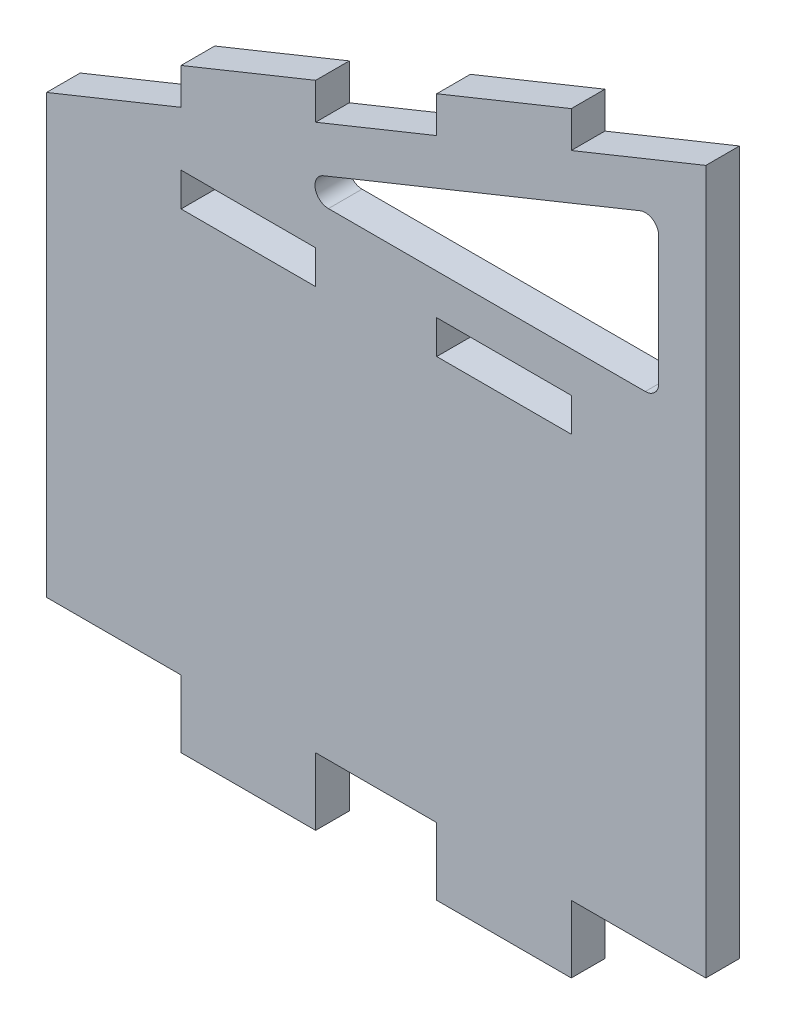
ISO-10303-21;
HEADER;
FILE_DESCRIPTION(('STEP AP214'),'2;1');
FILE_NAME('part.step','',(''),(''),'','','');
FILE_SCHEMA(('AUTOMOTIVE_DESIGN { 1 0 10303 214 1 1 1 1 }'));
ENDSEC;
DATA;
#1=APPLICATION_CONTEXT('core data for automotive mechanical design processes');
#2=APPLICATION_PROTOCOL_DEFINITION('international standard','automotive_design',2000,#1);
#3=PRODUCT_CONTEXT('',#1,'mechanical');
#4=PRODUCT('Part','Part','',(#3));
#5=PRODUCT_RELATED_PRODUCT_CATEGORY('part','',(#4));
#6=PRODUCT_DEFINITION_FORMATION('','',#4);
#7=PRODUCT_DEFINITION_CONTEXT('part definition',#1,'design');
#8=PRODUCT_DEFINITION('design','',#6,#7);
#9=PRODUCT_DEFINITION_SHAPE('','',#8);
#10=(LENGTH_UNIT() NAMED_UNIT(*) SI_UNIT(.MILLI.,.METRE.));
#11=(NAMED_UNIT(*) PLANE_ANGLE_UNIT() SI_UNIT($,.RADIAN.));
#12=(NAMED_UNIT(*) SI_UNIT($,.STERADIAN.) SOLID_ANGLE_UNIT());
#13=UNCERTAINTY_MEASURE_WITH_UNIT(LENGTH_MEASURE(1.E-05),#10,'distance_accuracy_value','');
#14=(GEOMETRIC_REPRESENTATION_CONTEXT(3) GLOBAL_UNCERTAINTY_ASSIGNED_CONTEXT((#13)) GLOBAL_UNIT_ASSIGNED_CONTEXT((#10,
#11,#12)) REPRESENTATION_CONTEXT('',''));
#15=CARTESIAN_POINT('',(0.,0.,0.));
#16=DIRECTION('',(0.,0.,1.));
#17=DIRECTION('',(1.,0.,0.));
#18=AXIS2_PLACEMENT_3D('',#15,#16,#17);
#19=CARTESIAN_POINT('',(0.,0.,2.5));
#20=DIRECTION('',(0.,0.,1.));
#21=DIRECTION('',(1.,0.,0.));
#22=AXIS2_PLACEMENT_3D('',#19,#20,#21);
#23=PLANE('',#22);
#24=DIRECTION('',(0.,-1.,0.));
#25=VECTOR('',#24,1.);
#26=CARTESIAN_POINT('',(-24.5,7.49999999999999,2.5));
#27=LINE('',#26,#25);
#28=CARTESIAN_POINT('',(-24.5,7.49999999999999,2.5));
#29=VERTEX_POINT('',#28);
#30=CARTESIAN_POINT('',(-24.5,-25.,2.5));
#31=VERTEX_POINT('',#30);
#32=EDGE_CURVE('E367',#29,#31,#27,.T.);
#33=ORIENTED_EDGE('',*,*,#32,.T.);
#34=DIRECTION('',(1.,0.,0.));
#35=VECTOR('',#34,1.);
#36=CARTESIAN_POINT('',(-24.5,-25.,2.5));
#37=LINE('',#36,#35);
#38=CARTESIAN_POINT('',(-14.5,-25.,2.5));
#39=VERTEX_POINT('',#38);
#40=EDGE_CURVE('E370',#31,#39,#37,.T.);
#41=ORIENTED_EDGE('',*,*,#40,.T.);
#42=DIRECTION('',(0.,-1.,0.));
#43=VECTOR('',#42,1.);
#44=CARTESIAN_POINT('',(-14.5,-25.,2.5));
#45=LINE('',#44,#43);
#46=CARTESIAN_POINT('',(-14.5,-30.,2.5));
#47=VERTEX_POINT('',#46);
#48=EDGE_CURVE('E373',#39,#47,#45,.T.);
#49=ORIENTED_EDGE('',*,*,#48,.T.);
#50=DIRECTION('',(1.,0.,0.));
#51=VECTOR('',#50,1.);
#52=CARTESIAN_POINT('',(-14.5,-30.,2.5));
#53=LINE('',#52,#51);
#54=CARTESIAN_POINT('',(-4.5,-30.,2.5));
#55=VERTEX_POINT('',#54);
#56=EDGE_CURVE('E375',#47,#55,#53,.T.);
#57=ORIENTED_EDGE('',*,*,#56,.T.);
#58=DIRECTION('',(0.,1.,0.));
#59=VECTOR('',#58,1.);
#60=CARTESIAN_POINT('',(-4.5,-30.,2.5));
#61=LINE('',#60,#59);
#62=CARTESIAN_POINT('',(-4.5,-25.,2.5));
#63=VERTEX_POINT('',#62);
#64=EDGE_CURVE('E377',#55,#63,#61,.T.);
#65=ORIENTED_EDGE('',*,*,#64,.T.);
#66=DIRECTION('',(1.,0.,0.));
#67=VECTOR('',#66,1.);
#68=CARTESIAN_POINT('',(-4.5,-25.,2.5));
#69=LINE('',#68,#67);
#70=CARTESIAN_POINT('',(4.5,-25.,2.5));
#71=VERTEX_POINT('',#70);
#72=EDGE_CURVE('E379',#63,#71,#69,.T.);
#73=ORIENTED_EDGE('',*,*,#72,.T.);
#74=DIRECTION('',(0.,-1.,0.));
#75=VECTOR('',#74,1.);
#76=CARTESIAN_POINT('',(4.5,-25.,2.5));
#77=LINE('',#76,#75);
#78=CARTESIAN_POINT('',(4.5,-30.,2.5));
#79=VERTEX_POINT('',#78);
#80=EDGE_CURVE('E381',#71,#79,#77,.T.);
#81=ORIENTED_EDGE('',*,*,#80,.T.);
#82=DIRECTION('',(1.,0.,0.));
#83=VECTOR('',#82,1.);
#84=CARTESIAN_POINT('',(4.5,-30.,2.5));
#85=LINE('',#84,#83);
#86=CARTESIAN_POINT('',(14.5,-30.,2.5));
#87=VERTEX_POINT('',#86);
#88=EDGE_CURVE('E383',#79,#87,#85,.T.);
#89=ORIENTED_EDGE('',*,*,#88,.T.);
#90=DIRECTION('',(0.,1.,0.));
#91=VECTOR('',#90,1.);
#92=CARTESIAN_POINT('',(14.5,-30.,2.5));
#93=LINE('',#92,#91);
#94=CARTESIAN_POINT('',(14.5,-25.,2.5));
#95=VERTEX_POINT('',#94);
#96=EDGE_CURVE('E385',#87,#95,#93,.T.);
#97=ORIENTED_EDGE('',*,*,#96,.T.);
#98=DIRECTION('',(1.,0.,0.));
#99=VECTOR('',#98,1.);
#100=CARTESIAN_POINT('',(14.5,-25.,2.5));
#101=LINE('',#100,#99);
#102=CARTESIAN_POINT('',(24.5,-25.,2.5));
#103=VERTEX_POINT('',#102);
#104=EDGE_CURVE('E387',#95,#103,#101,.T.);
#105=ORIENTED_EDGE('',*,*,#104,.T.);
#106=DIRECTION('',(0.,1.,0.));
#107=VECTOR('',#106,1.);
#108=CARTESIAN_POINT('',(24.5,-25.,2.5));
#109=LINE('',#108,#107);
#110=CARTESIAN_POINT('',(24.5,27.3035435119939,2.5));
#111=VERTEX_POINT('',#110);
#112=EDGE_CURVE('E389',#103,#111,#109,.T.);
#113=ORIENTED_EDGE('',*,*,#112,.T.);
#114=DIRECTION('',(-0.927142719016619,-0.374708391385182,0.));
#115=VECTOR('',#114,1.);
#116=CARTESIAN_POINT('',(24.5,27.3035435119939,2.5));
#117=LINE('',#116,#115);
#118=CARTESIAN_POINT('',(14.5,23.2620040197502,2.5));
#119=VERTEX_POINT('',#118);
#120=EDGE_CURVE('E391',#111,#119,#117,.T.);
#121=ORIENTED_EDGE('',*,*,#120,.T.);
#122=DIRECTION('',(0.,1.,0.));
#123=VECTOR('',#122,1.);
#124=CARTESIAN_POINT('',(14.5,23.2620040197502,2.5));
#125=LINE('',#124,#123);
#126=CARTESIAN_POINT('',(14.5,25.9584605077563,2.5));
#127=VERTEX_POINT('',#126);
#128=EDGE_CURVE('E393',#119,#127,#125,.T.);
#129=ORIENTED_EDGE('',*,*,#128,.T.);
#130=DIRECTION('',(-0.927142719016619,-0.374708391385182,0.));
#131=VECTOR('',#130,1.);
#132=CARTESIAN_POINT('',(14.5,25.9584605077563,2.5));
#133=LINE('',#132,#131);
#134=CARTESIAN_POINT('',(4.5,21.9169210155127,2.5));
#135=VERTEX_POINT('',#134);
#136=EDGE_CURVE('E395',#127,#135,#133,.T.);
#137=ORIENTED_EDGE('',*,*,#136,.T.);
#138=DIRECTION('',(0.,-1.,0.));
#139=VECTOR('',#138,1.);
#140=CARTESIAN_POINT('',(4.5,21.9169210155127,2.5));
#141=LINE('',#140,#139);
#142=CARTESIAN_POINT('',(4.5,19.2204645275066,2.5));
#143=VERTEX_POINT('',#142);
#144=EDGE_CURVE('E397',#135,#143,#141,.T.);
#145=ORIENTED_EDGE('',*,*,#144,.T.);
#146=DIRECTION('',(-0.927142719016619,-0.374708391385182,0.));
#147=VECTOR('',#146,1.);
#148=CARTESIAN_POINT('',(4.5,19.2204645275066,2.5));
#149=LINE('',#148,#147);
#150=CARTESIAN_POINT('',(-4.5,15.5830789844873,2.5));
#151=VERTEX_POINT('',#150);
#152=EDGE_CURVE('E399',#143,#151,#149,.T.);
#153=ORIENTED_EDGE('',*,*,#152,.T.);
#154=DIRECTION('',(0.,1.,0.));
#155=VECTOR('',#154,1.);
#156=CARTESIAN_POINT('',(-4.5,15.5830789844873,2.5));
#157=LINE('',#156,#155);
#158=CARTESIAN_POINT('',(-4.5,18.2795354724934,2.5));
#159=VERTEX_POINT('',#158);
#160=EDGE_CURVE('E401',#151,#159,#157,.T.);
#161=ORIENTED_EDGE('',*,*,#160,.T.);
#162=DIRECTION('',(-0.927142719016619,-0.374708391385182,0.));
#163=VECTOR('',#162,1.);
#164=CARTESIAN_POINT('',(-4.5,18.2795354724934,2.5));
#165=LINE('',#164,#163);
#166=CARTESIAN_POINT('',(-14.5,14.2379959802498,2.5));
#167=VERTEX_POINT('',#166);
#168=EDGE_CURVE('E403',#159,#167,#165,.T.);
#169=ORIENTED_EDGE('',*,*,#168,.T.);
#170=DIRECTION('',(0.,-1.,0.));
#171=VECTOR('',#170,1.);
#172=CARTESIAN_POINT('',(-14.5,14.2379959802498,2.5));
#173=LINE('',#172,#171);
#174=CARTESIAN_POINT('',(-14.5,11.5415394922436,2.5));
#175=VERTEX_POINT('',#174);
#176=EDGE_CURVE('E405',#167,#175,#173,.T.);
#177=ORIENTED_EDGE('',*,*,#176,.T.);
#178=DIRECTION('',(-0.927142719016619,-0.374708391385182,0.));
#179=VECTOR('',#178,1.);
#180=CARTESIAN_POINT('',(-14.5,11.5415394922436,2.5));
#181=LINE('',#180,#179);
#182=EDGE_CURVE('E407',#175,#29,#181,.T.);
#183=ORIENTED_EDGE('',*,*,#182,.T.);
#184=EDGE_LOOP('',(#33,#41,#49,#57,#65,#73,#81,#89,#97,#105,#113,#121,#129,#137,#145,#153,#161,
#169,#177,#183));
#185=FACE_BOUND('',#184,.T.);
#186=DIRECTION('',(1.,0.,0.));
#187=VECTOR('',#186,1.);
#188=CARTESIAN_POINT('',(-14.5,4.99999999999999,2.5));
#189=LINE('',#188,#187);
#190=CARTESIAN_POINT('',(-14.5,4.99999999999999,2.5));
#191=VERTEX_POINT('',#190);
#192=CARTESIAN_POINT('',(-4.5,4.99999999999999,2.5));
#193=VERTEX_POINT('',#192);
#194=EDGE_CURVE('E338',#191,#193,#189,.T.);
#195=ORIENTED_EDGE('',*,*,#194,.F.);
#196=DIRECTION('',(0.,-1.,0.));
#197=VECTOR('',#196,1.);
#198=CARTESIAN_POINT('',(-14.5,4.99999999999999,2.5));
#199=LINE('',#198,#197);
#200=CARTESIAN_POINT('',(-14.5,7.5,2.5));
#201=VERTEX_POINT('',#200);
#202=EDGE_CURVE('E336',#201,#191,#199,.T.);
#203=ORIENTED_EDGE('',*,*,#202,.F.);
#204=DIRECTION('',(-1.,0.,0.));
#205=VECTOR('',#204,1.);
#206=CARTESIAN_POINT('',(-14.5,7.5,2.5));
#207=LINE('',#206,#205);
#208=CARTESIAN_POINT('',(-4.5,7.5,2.5));
#209=VERTEX_POINT('',#208);
#210=EDGE_CURVE('E344',#209,#201,#207,.T.);
#211=ORIENTED_EDGE('',*,*,#210,.F.);
#212=DIRECTION('',(0.,1.,0.));
#213=VECTOR('',#212,1.);
#214=CARTESIAN_POINT('',(-4.5,4.99999999999999,2.5));
#215=LINE('',#214,#213);
#216=EDGE_CURVE('E341',#193,#209,#215,.T.);
#217=ORIENTED_EDGE('',*,*,#216,.F.);
#218=EDGE_LOOP('',(#195,#203,#211,#217));
#219=FACE_BOUND('',#218,.T.);
#220=DIRECTION('',(1.,0.,0.));
#221=VECTOR('',#220,1.);
#222=CARTESIAN_POINT('',(4.5,4.99999999999999,2.5));
#223=LINE('',#222,#221);
#224=CARTESIAN_POINT('',(4.5,4.99999999999999,2.5));
#225=VERTEX_POINT('',#224);
#226=CARTESIAN_POINT('',(14.5,4.99999999999999,2.5));
#227=VERTEX_POINT('',#226);
#228=EDGE_CURVE('E307',#225,#227,#223,.T.);
#229=ORIENTED_EDGE('',*,*,#228,.F.);
#230=DIRECTION('',(0.,-1.,0.));
#231=VECTOR('',#230,1.);
#232=CARTESIAN_POINT('',(4.5,4.99999999999999,2.5));
#233=LINE('',#232,#231);
#234=CARTESIAN_POINT('',(4.5,7.5,2.5));
#235=VERTEX_POINT('',#234);
#236=EDGE_CURVE('E305',#235,#225,#233,.T.);
#237=ORIENTED_EDGE('',*,*,#236,.F.);
#238=DIRECTION('',(-1.,0.,0.));
#239=VECTOR('',#238,1.);
#240=CARTESIAN_POINT('',(4.5,7.5,2.5));
#241=LINE('',#240,#239);
#242=CARTESIAN_POINT('',(14.5,7.5,2.5));
#243=VERTEX_POINT('',#242);
#244=EDGE_CURVE('E313',#243,#235,#241,.T.);
#245=ORIENTED_EDGE('',*,*,#244,.F.);
#246=DIRECTION('',(0.,1.,0.));
#247=VECTOR('',#246,1.);
#248=CARTESIAN_POINT('',(14.5,4.99999999999999,2.5));
#249=LINE('',#248,#247);
#250=EDGE_CURVE('E310',#227,#243,#249,.T.);
#251=ORIENTED_EDGE('',*,*,#250,.F.);
#252=EDGE_LOOP('',(#229,#237,#245,#251));
#253=FACE_BOUND('',#252,.T.);
#254=DIRECTION('',(0.,1.,0.));
#255=VECTOR('',#254,1.);
#256=CARTESIAN_POINT('',(21.,21.0172634555732,2.5));
#257=LINE('',#256,#255);
#258=CARTESIAN_POINT('',(21.,11.5,2.5));
#259=VERTEX_POINT('',#258);
#260=CARTESIAN_POINT('',(21.,21.0172634555732,2.5));
#261=VERTEX_POINT('',#260);
#262=EDGE_CURVE('E262',#259,#261,#257,.T.);
#263=ORIENTED_EDGE('',*,*,#262,.F.);
#264=CARTESIAN_POINT('',(20.,11.5,2.5));
#265=DIRECTION('',(0.,0.,1.));
#266=DIRECTION('',(-1.,0.,0.));
#267=AXIS2_PLACEMENT_3D('',#264,#265,#266);
#268=CIRCLE('',#267,1.);
#269=CARTESIAN_POINT('',(20.,10.5,2.5));
#270=VERTEX_POINT('',#269);
#271=EDGE_CURVE('E254',#270,#259,#268,.T.);
#272=ORIENTED_EDGE('',*,*,#271,.F.);
#273=DIRECTION('',(1.,0.,0.));
#274=VECTOR('',#273,1.);
#275=CARTESIAN_POINT('',(20.,10.5,2.5));
#276=LINE('',#275,#274);
#277=CARTESIAN_POINT('',(-3.54860932037972,10.5,2.5));
#278=VERTEX_POINT('',#277);
#279=EDGE_CURVE('E283',#278,#270,#276,.T.);
#280=ORIENTED_EDGE('',*,*,#279,.F.);
#281=CARTESIAN_POINT('',(-3.54860932037981,11.5,2.5));
#282=DIRECTION('',(0.,0.,1.));
#283=DIRECTION('',(1.,0.,0.));
#284=AXIS2_PLACEMENT_3D('',#281,#282,#283);
#285=CIRCLE('',#284,1.);
#286=CARTESIAN_POINT('',(-3.92331771176491,12.4271427190167,2.5));
#287=VERTEX_POINT('',#286);
#288=EDGE_CURVE('E281',#287,#278,#285,.T.);
#289=ORIENTED_EDGE('',*,*,#288,.F.);
#290=DIRECTION('',(-0.927142719016619,-0.374708391385182,0.));
#291=VECTOR('',#290,1.);
#292=CARTESIAN_POINT('',(-3.92331771176491,12.4271427190167,2.5));
#293=LINE('',#292,#291);
#294=CARTESIAN_POINT('',(19.6252916086148,21.9444061745898,2.5));
#295=VERTEX_POINT('',#294);
#296=EDGE_CURVE('E277',#295,#287,#293,.T.);
#297=ORIENTED_EDGE('',*,*,#296,.F.);
#298=CARTESIAN_POINT('',(20.,21.0172634555732,2.5));
#299=DIRECTION('',(0.,0.,1.));
#300=DIRECTION('',(1.,0.,0.));
#301=AXIS2_PLACEMENT_3D('',#298,#299,#300);
#302=CIRCLE('',#301,1.);
#303=EDGE_CURVE('E275',#261,#295,#302,.T.);
#304=ORIENTED_EDGE('',*,*,#303,.F.);
#305=EDGE_LOOP('',(#263,#272,#280,#289,#297,#304));
#306=FACE_BOUND('',#305,.T.);
#307=ADVANCED_FACE('F33',(#185,#219,#253,#306),#23,.T.);
#308=CARTESIAN_POINT('',(0.,0.,0.));
#309=DIRECTION('',(0.,0.,1.));
#310=DIRECTION('',(1.,0.,0.));
#311=AXIS2_PLACEMENT_3D('',#308,#309,#310);
#312=PLANE('',#311);
#313=DIRECTION('',(0.,-1.,0.));
#314=VECTOR('',#313,1.);
#315=CARTESIAN_POINT('',(4.5,4.99999999999999,0.));
#316=LINE('',#315,#314);
#317=CARTESIAN_POINT('',(4.5,7.5,0.));
#318=VERTEX_POINT('',#317);
#319=CARTESIAN_POINT('',(4.5,4.99999999999999,0.));
#320=VERTEX_POINT('',#319);
#321=EDGE_CURVE('E270',#318,#320,#316,.T.);
#322=ORIENTED_EDGE('',*,*,#321,.T.);
#323=DIRECTION('',(1.,0.,0.));
#324=VECTOR('',#323,1.);
#325=CARTESIAN_POINT('',(4.5,4.99999999999999,0.));
#326=LINE('',#325,#324);
#327=CARTESIAN_POINT('',(14.5,4.99999999999999,0.));
#328=VERTEX_POINT('',#327);
#329=EDGE_CURVE('E318',#320,#328,#326,.T.);
#330=ORIENTED_EDGE('',*,*,#329,.T.);
#331=DIRECTION('',(0.,1.,0.));
#332=VECTOR('',#331,1.);
#333=CARTESIAN_POINT('',(14.5,4.99999999999999,0.));
#334=LINE('',#333,#332);
#335=CARTESIAN_POINT('',(14.5,7.5,0.));
#336=VERTEX_POINT('',#335);
#337=EDGE_CURVE('E321',#328,#336,#334,.T.);
#338=ORIENTED_EDGE('',*,*,#337,.T.);
#339=DIRECTION('',(-1.,0.,0.));
#340=VECTOR('',#339,1.);
#341=CARTESIAN_POINT('',(4.5,7.5,0.));
#342=LINE('',#341,#340);
#343=EDGE_CURVE('E308',#336,#318,#342,.T.);
#344=ORIENTED_EDGE('',*,*,#343,.T.);
#345=EDGE_LOOP('',(#322,#330,#338,#344));
#346=FACE_BOUND('',#345,.T.);
#347=DIRECTION('',(0.,-1.,0.));
#348=VECTOR('',#347,1.);
#349=CARTESIAN_POINT('',(-24.5,7.49999999999999,0.));
#350=LINE('',#349,#348);
#351=CARTESIAN_POINT('',(-24.5,7.49999999999999,0.));
#352=VERTEX_POINT('',#351);
#353=CARTESIAN_POINT('',(-24.5,-25.,0.));
#354=VERTEX_POINT('',#353);
#355=EDGE_CURVE('E366',#352,#354,#350,.T.);
#356=ORIENTED_EDGE('',*,*,#355,.F.);
#357=DIRECTION('',(-0.927142719016619,-0.374708391385182,0.));
#358=VECTOR('',#357,1.);
#359=CARTESIAN_POINT('',(-14.5,11.5415394922436,0.));
#360=LINE('',#359,#358);
#361=CARTESIAN_POINT('',(-14.5,11.5415394922436,0.));
#362=VERTEX_POINT('',#361);
#363=EDGE_CURVE('E371',#362,#352,#360,.T.);
#364=ORIENTED_EDGE('',*,*,#363,.F.);
#365=DIRECTION('',(0.,-1.,0.));
#366=VECTOR('',#365,1.);
#367=CARTESIAN_POINT('',(-14.5,14.2379959802498,0.));
#368=LINE('',#367,#366);
#369=CARTESIAN_POINT('',(-14.5,14.2379959802498,0.));
#370=VERTEX_POINT('',#369);
#371=EDGE_CURVE('E446',#370,#362,#368,.T.);
#372=ORIENTED_EDGE('',*,*,#371,.F.);
#373=DIRECTION('',(-0.927142719016619,-0.374708391385182,0.));
#374=VECTOR('',#373,1.);
#375=CARTESIAN_POINT('',(-4.5,18.2795354724934,0.));
#376=LINE('',#375,#374);
#377=CARTESIAN_POINT('',(-4.5,18.2795354724934,0.));
#378=VERTEX_POINT('',#377);
#379=EDGE_CURVE('E444',#378,#370,#376,.T.);
#380=ORIENTED_EDGE('',*,*,#379,.F.);
#381=DIRECTION('',(0.,1.,0.));
#382=VECTOR('',#381,1.);
#383=CARTESIAN_POINT('',(-4.5,15.5830789844873,0.));
#384=LINE('',#383,#382);
#385=CARTESIAN_POINT('',(-4.5,15.5830789844873,0.));
#386=VERTEX_POINT('',#385);
#387=EDGE_CURVE('E442',#386,#378,#384,.T.);
#388=ORIENTED_EDGE('',*,*,#387,.F.);
#389=DIRECTION('',(-0.927142719016619,-0.374708391385182,0.));
#390=VECTOR('',#389,1.);
#391=CARTESIAN_POINT('',(4.5,19.2204645275066,0.));
#392=LINE('',#391,#390);
#393=CARTESIAN_POINT('',(4.5,19.2204645275066,0.));
#394=VERTEX_POINT('',#393);
#395=EDGE_CURVE('E440',#394,#386,#392,.T.);
#396=ORIENTED_EDGE('',*,*,#395,.F.);
#397=DIRECTION('',(0.,-1.,0.));
#398=VECTOR('',#397,1.);
#399=CARTESIAN_POINT('',(4.5,21.9169210155127,0.));
#400=LINE('',#399,#398);
#401=CARTESIAN_POINT('',(4.5,21.9169210155127,0.));
#402=VERTEX_POINT('',#401);
#403=EDGE_CURVE('E438',#402,#394,#400,.T.);
#404=ORIENTED_EDGE('',*,*,#403,.F.);
#405=DIRECTION('',(-0.927142719016619,-0.374708391385182,0.));
#406=VECTOR('',#405,1.);
#407=CARTESIAN_POINT('',(14.5,25.9584605077563,0.));
#408=LINE('',#407,#406);
#409=CARTESIAN_POINT('',(14.5,25.9584605077563,0.));
#410=VERTEX_POINT('',#409);
#411=EDGE_CURVE('E436',#410,#402,#408,.T.);
#412=ORIENTED_EDGE('',*,*,#411,.F.);
#413=DIRECTION('',(0.,1.,0.));
#414=VECTOR('',#413,1.);
#415=CARTESIAN_POINT('',(14.5,23.2620040197502,0.));
#416=LINE('',#415,#414);
#417=CARTESIAN_POINT('',(14.5,23.2620040197502,0.));
#418=VERTEX_POINT('',#417);
#419=EDGE_CURVE('E434',#418,#410,#416,.T.);
#420=ORIENTED_EDGE('',*,*,#419,.F.);
#421=DIRECTION('',(-0.927142719016619,-0.374708391385182,0.));
#422=VECTOR('',#421,1.);
#423=CARTESIAN_POINT('',(24.5,27.3035435119939,0.));
#424=LINE('',#423,#422);
#425=CARTESIAN_POINT('',(24.5,27.3035435119939,0.));
#426=VERTEX_POINT('',#425);
#427=EDGE_CURVE('E432',#426,#418,#424,.T.);
#428=ORIENTED_EDGE('',*,*,#427,.F.);
#429=DIRECTION('',(0.,1.,0.));
#430=VECTOR('',#429,1.);
#431=CARTESIAN_POINT('',(24.5,-25.,0.));
#432=LINE('',#431,#430);
#433=CARTESIAN_POINT('',(24.5,-25.,0.));
#434=VERTEX_POINT('',#433);
#435=EDGE_CURVE('E430',#434,#426,#432,.T.);
#436=ORIENTED_EDGE('',*,*,#435,.F.);
#437=DIRECTION('',(1.,0.,0.));
#438=VECTOR('',#437,1.);
#439=CARTESIAN_POINT('',(14.5,-25.,0.));
#440=LINE('',#439,#438);
#441=CARTESIAN_POINT('',(14.5,-25.,0.));
#442=VERTEX_POINT('',#441);
#443=EDGE_CURVE('E428',#442,#434,#440,.T.);
#444=ORIENTED_EDGE('',*,*,#443,.F.);
#445=DIRECTION('',(0.,1.,0.));
#446=VECTOR('',#445,1.);
#447=CARTESIAN_POINT('',(14.5,-30.,0.));
#448=LINE('',#447,#446);
#449=CARTESIAN_POINT('',(14.5,-30.,0.));
#450=VERTEX_POINT('',#449);
#451=EDGE_CURVE('E426',#450,#442,#448,.T.);
#452=ORIENTED_EDGE('',*,*,#451,.F.);
#453=DIRECTION('',(1.,0.,0.));
#454=VECTOR('',#453,1.);
#455=CARTESIAN_POINT('',(4.5,-30.,0.));
#456=LINE('',#455,#454);
#457=CARTESIAN_POINT('',(4.5,-30.,0.));
#458=VERTEX_POINT('',#457);
#459=EDGE_CURVE('E424',#458,#450,#456,.T.);
#460=ORIENTED_EDGE('',*,*,#459,.F.);
#461=DIRECTION('',(0.,-1.,0.));
#462=VECTOR('',#461,1.);
#463=CARTESIAN_POINT('',(4.5,-25.,0.));
#464=LINE('',#463,#462);
#465=CARTESIAN_POINT('',(4.5,-25.,0.));
#466=VERTEX_POINT('',#465);
#467=EDGE_CURVE('E422',#466,#458,#464,.T.);
#468=ORIENTED_EDGE('',*,*,#467,.F.);
#469=DIRECTION('',(1.,0.,0.));
#470=VECTOR('',#469,1.);
#471=CARTESIAN_POINT('',(-4.5,-25.,0.));
#472=LINE('',#471,#470);
#473=CARTESIAN_POINT('',(-4.5,-25.,0.));
#474=VERTEX_POINT('',#473);
#475=EDGE_CURVE('E420',#474,#466,#472,.T.);
#476=ORIENTED_EDGE('',*,*,#475,.F.);
#477=DIRECTION('',(0.,1.,0.));
#478=VECTOR('',#477,1.);
#479=CARTESIAN_POINT('',(-4.5,-30.,0.));
#480=LINE('',#479,#478);
#481=CARTESIAN_POINT('',(-4.5,-30.,0.));
#482=VERTEX_POINT('',#481);
#483=EDGE_CURVE('E418',#482,#474,#480,.T.);
#484=ORIENTED_EDGE('',*,*,#483,.F.);
#485=DIRECTION('',(1.,0.,0.));
#486=VECTOR('',#485,1.);
#487=CARTESIAN_POINT('',(-14.5,-30.,0.));
#488=LINE('',#487,#486);
#489=CARTESIAN_POINT('',(-14.5,-30.,0.));
#490=VERTEX_POINT('',#489);
#491=EDGE_CURVE('E416',#490,#482,#488,.T.);
#492=ORIENTED_EDGE('',*,*,#491,.F.);
#493=DIRECTION('',(0.,-1.,0.));
#494=VECTOR('',#493,1.);
#495=CARTESIAN_POINT('',(-14.5,-25.,0.));
#496=LINE('',#495,#494);
#497=CARTESIAN_POINT('',(-14.5,-25.,0.));
#498=VERTEX_POINT('',#497);
#499=EDGE_CURVE('E414',#498,#490,#496,.T.);
#500=ORIENTED_EDGE('',*,*,#499,.F.);
#501=DIRECTION('',(1.,0.,0.));
#502=VECTOR('',#501,1.);
#503=CARTESIAN_POINT('',(-24.5,-25.,0.));
#504=LINE('',#503,#502);
#505=EDGE_CURVE('E412',#354,#498,#504,.T.);
#506=ORIENTED_EDGE('',*,*,#505,.F.);
#507=EDGE_LOOP('',(#356,#364,#372,#380,#388,#396,#404,#412,#420,#428,#436,#444,#452,#460,#468,
#476,#484,#492,#500,#506));
#508=FACE_BOUND('',#507,.T.);
#509=DIRECTION('',(0.,-1.,0.));
#510=VECTOR('',#509,1.);
#511=CARTESIAN_POINT('',(-14.5,4.99999999999999,0.));
#512=LINE('',#511,#510);
#513=CARTESIAN_POINT('',(-14.5,7.5,0.));
#514=VERTEX_POINT('',#513);
#515=CARTESIAN_POINT('',(-14.5,4.99999999999999,0.));
#516=VERTEX_POINT('',#515);
#517=EDGE_CURVE('E335',#514,#516,#512,.T.);
#518=ORIENTED_EDGE('',*,*,#517,.T.);
#519=DIRECTION('',(1.,0.,0.));
#520=VECTOR('',#519,1.);
#521=CARTESIAN_POINT('',(-14.5,4.99999999999999,0.));
#522=LINE('',#521,#520);
#523=CARTESIAN_POINT('',(-4.5,4.99999999999999,0.));
#524=VERTEX_POINT('',#523);
#525=EDGE_CURVE('E349',#516,#524,#522,.T.);
#526=ORIENTED_EDGE('',*,*,#525,.T.);
#527=DIRECTION('',(0.,1.,0.));
#528=VECTOR('',#527,1.);
#529=CARTESIAN_POINT('',(-4.5,4.99999999999999,0.));
#530=LINE('',#529,#528);
#531=CARTESIAN_POINT('',(-4.5,7.5,0.));
#532=VERTEX_POINT('',#531);
#533=EDGE_CURVE('E352',#524,#532,#530,.T.);
#534=ORIENTED_EDGE('',*,*,#533,.T.);
#535=DIRECTION('',(-1.,0.,0.));
#536=VECTOR('',#535,1.);
#537=CARTESIAN_POINT('',(-14.5,7.5,0.));
#538=LINE('',#537,#536);
#539=EDGE_CURVE('E339',#532,#514,#538,.T.);
#540=ORIENTED_EDGE('',*,*,#539,.T.);
#541=EDGE_LOOP('',(#518,#526,#534,#540));
#542=FACE_BOUND('',#541,.T.);
#543=CARTESIAN_POINT('',(20.,11.5,0.));
#544=DIRECTION('',(0.,0.,1.));
#545=DIRECTION('',(-1.,0.,0.));
#546=AXIS2_PLACEMENT_3D('',#543,#544,#545);
#547=CIRCLE('',#546,1.);
#548=CARTESIAN_POINT('',(20.,10.5,0.));
#549=VERTEX_POINT('',#548);
#550=CARTESIAN_POINT('',(21.,11.5,0.));
#551=VERTEX_POINT('',#550);
#552=EDGE_CURVE('E56',#549,#551,#547,.T.);
#553=ORIENTED_EDGE('',*,*,#552,.T.);
#554=DIRECTION('',(0.,1.,0.));
#555=VECTOR('',#554,1.);
#556=CARTESIAN_POINT('',(21.,21.0172634555732,0.));
#557=LINE('',#556,#555);
#558=CARTESIAN_POINT('',(21.,21.0172634555732,0.));
#559=VERTEX_POINT('',#558);
#560=EDGE_CURVE('E269',#551,#559,#557,.T.);
#561=ORIENTED_EDGE('',*,*,#560,.T.);
#562=CARTESIAN_POINT('',(20.,21.0172634555732,0.));
#563=DIRECTION('',(0.,0.,1.));
#564=DIRECTION('',(1.,0.,0.));
#565=AXIS2_PLACEMENT_3D('',#562,#563,#564);
#566=CIRCLE('',#565,1.);
#567=CARTESIAN_POINT('',(19.6252916086148,21.9444061745898,0.));
#568=VERTEX_POINT('',#567);
#569=EDGE_CURVE('E287',#559,#568,#566,.T.);
#570=ORIENTED_EDGE('',*,*,#569,.T.);
#571=DIRECTION('',(-0.927142719016619,-0.374708391385182,0.));
#572=VECTOR('',#571,1.);
#573=CARTESIAN_POINT('',(-3.92331771176491,12.4271427190167,0.));
#574=LINE('',#573,#572);
#575=CARTESIAN_POINT('',(-3.92331771176491,12.4271427190167,0.));
#576=VERTEX_POINT('',#575);
#577=EDGE_CURVE('E290',#568,#576,#574,.T.);
#578=ORIENTED_EDGE('',*,*,#577,.T.);
#579=CARTESIAN_POINT('',(-3.54860932037981,11.5,0.));
#580=DIRECTION('',(0.,0.,1.));
#581=DIRECTION('',(1.,0.,0.));
#582=AXIS2_PLACEMENT_3D('',#579,#580,#581);
#583=CIRCLE('',#582,1.);
#584=CARTESIAN_POINT('',(-3.54860932037972,10.5,0.));
#585=VERTEX_POINT('',#584);
#586=EDGE_CURVE('E293',#576,#585,#583,.T.);
#587=ORIENTED_EDGE('',*,*,#586,.T.);
#588=DIRECTION('',(1.,0.,0.));
#589=VECTOR('',#588,1.);
#590=CARTESIAN_POINT('',(20.,10.5,0.));
#591=LINE('',#590,#589);
#592=EDGE_CURVE('E263',#585,#549,#591,.T.);
#593=ORIENTED_EDGE('',*,*,#592,.T.);
#594=EDGE_LOOP('',(#553,#561,#570,#578,#587,#593));
#595=FACE_BOUND('',#594,.T.);
#596=ADVANCED_FACE('F512',(#346,#508,#542,#595),#312,.F.);
#597=CARTESIAN_POINT('',(-24.5,7.49999999999999,2.5));
#598=DIRECTION('',(1.,0.,0.));
#599=DIRECTION('',(0.,0.,-1.));
#600=AXIS2_PLACEMENT_3D('',#597,#598,#599);
#601=PLANE('',#600);
#602=ORIENTED_EDGE('',*,*,#355,.T.);
#603=DIRECTION('',(0.,0.,-1.));
#604=VECTOR('',#603,1.);
#605=CARTESIAN_POINT('',(-24.5,-25.,2.5));
#606=LINE('',#605,#604);
#607=EDGE_CURVE('E11',#31,#354,#606,.T.);
#608=ORIENTED_EDGE('',*,*,#607,.F.);
#609=ORIENTED_EDGE('',*,*,#32,.F.);
#610=DIRECTION('',(0.,0.,-1.));
#611=VECTOR('',#610,1.);
#612=CARTESIAN_POINT('',(-24.5,7.49999999999999,2.5));
#613=LINE('',#612,#611);
#614=EDGE_CURVE('E409',#29,#352,#613,.T.);
#615=ORIENTED_EDGE('',*,*,#614,.T.);
#616=EDGE_LOOP('',(#602,#608,#609,#615));
#617=FACE_BOUND('',#616,.T.);
#618=ADVANCED_FACE('F35',(#617),#601,.F.);
#619=CARTESIAN_POINT('',(-24.5,-25.,2.5));
#620=DIRECTION('',(0.,1.,0.));
#621=DIRECTION('',(-1.,0.,0.));
#622=AXIS2_PLACEMENT_3D('',#619,#620,#621);
#623=PLANE('',#622);
#624=ORIENTED_EDGE('',*,*,#505,.T.);
#625=DIRECTION('',(0.,0.,-1.));
#626=VECTOR('',#625,1.);
#627=CARTESIAN_POINT('',(-14.5,-25.,2.5));
#628=LINE('',#627,#626);
#629=EDGE_CURVE('E41',#39,#498,#628,.T.);
#630=ORIENTED_EDGE('',*,*,#629,.F.);
#631=ORIENTED_EDGE('',*,*,#40,.F.);
#632=ORIENTED_EDGE('',*,*,#607,.T.);
#633=EDGE_LOOP('',(#624,#630,#631,#632));
#634=FACE_BOUND('',#633,.T.);
#635=ADVANCED_FACE('F530',(#634),#623,.F.);
#636=CARTESIAN_POINT('',(-14.5,-25.,2.5));
#637=DIRECTION('',(1.,0.,0.));
#638=DIRECTION('',(0.,0.,-1.));
#639=AXIS2_PLACEMENT_3D('',#636,#637,#638);
#640=PLANE('',#639);
#641=ORIENTED_EDGE('',*,*,#499,.T.);
#642=DIRECTION('',(0.,0.,-1.));
#643=VECTOR('',#642,1.);
#644=CARTESIAN_POINT('',(-14.5,-30.,2.5));
#645=LINE('',#644,#643);
#646=EDGE_CURVE('E499',#47,#490,#645,.T.);
#647=ORIENTED_EDGE('',*,*,#646,.F.);
#648=ORIENTED_EDGE('',*,*,#48,.F.);
#649=ORIENTED_EDGE('',*,*,#629,.T.);
#650=EDGE_LOOP('',(#641,#647,#648,#649));
#651=FACE_BOUND('',#650,.T.);
#652=ADVANCED_FACE('F506',(#651),#640,.F.);
#653=CARTESIAN_POINT('',(-14.5,-30.,2.5));
#654=DIRECTION('',(0.,1.,0.));
#655=DIRECTION('',(0.,0.,1.));
#656=AXIS2_PLACEMENT_3D('',#653,#654,#655);
#657=PLANE('',#656);
#658=ORIENTED_EDGE('',*,*,#491,.T.);
#659=DIRECTION('',(0.,0.,-1.));
#660=VECTOR('',#659,1.);
#661=CARTESIAN_POINT('',(-4.5,-30.,2.5));
#662=LINE('',#661,#660);
#663=EDGE_CURVE('E496',#55,#482,#662,.T.);
#664=ORIENTED_EDGE('',*,*,#663,.F.);
#665=ORIENTED_EDGE('',*,*,#56,.F.);
#666=ORIENTED_EDGE('',*,*,#646,.T.);
#667=EDGE_LOOP('',(#658,#664,#665,#666));
#668=FACE_BOUND('',#667,.T.);
#669=ADVANCED_FACE('F518',(#668),#657,.F.);
#670=CARTESIAN_POINT('',(-4.5,-30.,2.5));
#671=DIRECTION('',(-1.,0.,0.));
#672=DIRECTION('',(0.,0.,1.));
#673=AXIS2_PLACEMENT_3D('',#670,#671,#672);
#674=PLANE('',#673);
#675=ORIENTED_EDGE('',*,*,#483,.T.);
#676=DIRECTION('',(0.,0.,-1.));
#677=VECTOR('',#676,1.);
#678=CARTESIAN_POINT('',(-4.5,-25.,2.5));
#679=LINE('',#678,#677);
#680=EDGE_CURVE('E493',#63,#474,#679,.T.);
#681=ORIENTED_EDGE('',*,*,#680,.F.);
#682=ORIENTED_EDGE('',*,*,#64,.F.);
#683=ORIENTED_EDGE('',*,*,#663,.T.);
#684=EDGE_LOOP('',(#675,#681,#682,#683));
#685=FACE_BOUND('',#684,.T.);
#686=ADVANCED_FACE('F522',(#685),#674,.F.);
#687=CARTESIAN_POINT('',(-4.5,-25.,2.5));
#688=DIRECTION('',(0.,1.,0.));
#689=DIRECTION('',(0.,0.,1.));
#690=AXIS2_PLACEMENT_3D('',#687,#688,#689);
#691=PLANE('',#690);
#692=ORIENTED_EDGE('',*,*,#475,.T.);
#693=DIRECTION('',(0.,0.,-1.));
#694=VECTOR('',#693,1.);
#695=CARTESIAN_POINT('',(4.5,-25.,2.5));
#696=LINE('',#695,#694);
#697=EDGE_CURVE('E490',#71,#466,#696,.T.);
#698=ORIENTED_EDGE('',*,*,#697,.F.);
#699=ORIENTED_EDGE('',*,*,#72,.F.);
#700=ORIENTED_EDGE('',*,*,#680,.T.);
#701=EDGE_LOOP('',(#692,#698,#699,#700));
#702=FACE_BOUND('',#701,.T.);
#703=ADVANCED_FACE('F603',(#702),#691,.F.);
#704=CARTESIAN_POINT('',(4.5,-25.,2.5));
#705=DIRECTION('',(1.,0.,0.));
#706=DIRECTION('',(0.,0.,-1.));
#707=AXIS2_PLACEMENT_3D('',#704,#705,#706);
#708=PLANE('',#707);
#709=ORIENTED_EDGE('',*,*,#467,.T.);
#710=DIRECTION('',(0.,0.,-1.));
#711=VECTOR('',#710,1.);
#712=CARTESIAN_POINT('',(4.5,-30.,2.5));
#713=LINE('',#712,#711);
#714=EDGE_CURVE('E487',#79,#458,#713,.T.);
#715=ORIENTED_EDGE('',*,*,#714,.F.);
#716=ORIENTED_EDGE('',*,*,#80,.F.);
#717=ORIENTED_EDGE('',*,*,#697,.T.);
#718=EDGE_LOOP('',(#709,#715,#716,#717));
#719=FACE_BOUND('',#718,.T.);
#720=ADVANCED_FACE('F601',(#719),#708,.F.);
#721=CARTESIAN_POINT('',(4.5,-30.,2.5));
#722=DIRECTION('',(0.,1.,0.));
#723=DIRECTION('',(0.,0.,1.));
#724=AXIS2_PLACEMENT_3D('',#721,#722,#723);
#725=PLANE('',#724);
#726=ORIENTED_EDGE('',*,*,#459,.T.);
#727=DIRECTION('',(0.,0.,-1.));
#728=VECTOR('',#727,1.);
#729=CARTESIAN_POINT('',(14.5,-30.,2.5));
#730=LINE('',#729,#728);
#731=EDGE_CURVE('E484',#87,#450,#730,.T.);
#732=ORIENTED_EDGE('',*,*,#731,.F.);
#733=ORIENTED_EDGE('',*,*,#88,.F.);
#734=ORIENTED_EDGE('',*,*,#714,.T.);
#735=EDGE_LOOP('',(#726,#732,#733,#734));
#736=FACE_BOUND('',#735,.T.);
#737=ADVANCED_FACE('F596',(#736),#725,.F.);
#738=CARTESIAN_POINT('',(14.5,-30.,2.5));
#739=DIRECTION('',(-1.,0.,0.));
#740=DIRECTION('',(0.,0.,1.));
#741=AXIS2_PLACEMENT_3D('',#738,#739,#740);
#742=PLANE('',#741);
#743=ORIENTED_EDGE('',*,*,#451,.T.);
#744=DIRECTION('',(0.,0.,-1.));
#745=VECTOR('',#744,1.);
#746=CARTESIAN_POINT('',(14.5,-25.,2.5));
#747=LINE('',#746,#745);
#748=EDGE_CURVE('E481',#95,#442,#747,.T.);
#749=ORIENTED_EDGE('',*,*,#748,.F.);
#750=ORIENTED_EDGE('',*,*,#96,.F.);
#751=ORIENTED_EDGE('',*,*,#731,.T.);
#752=EDGE_LOOP('',(#743,#749,#750,#751));
#753=FACE_BOUND('',#752,.T.);
#754=ADVANCED_FACE('F591',(#753),#742,.F.);
#755=CARTESIAN_POINT('',(14.5,-25.,2.5));
#756=DIRECTION('',(0.,1.,0.));
#757=DIRECTION('',(-1.,0.,0.));
#758=AXIS2_PLACEMENT_3D('',#755,#756,#757);
#759=PLANE('',#758);
#760=ORIENTED_EDGE('',*,*,#443,.T.);
#761=DIRECTION('',(0.,0.,-1.));
#762=VECTOR('',#761,1.);
#763=CARTESIAN_POINT('',(24.5,-25.,2.5));
#764=LINE('',#763,#762);
#765=EDGE_CURVE('E478',#103,#434,#764,.T.);
#766=ORIENTED_EDGE('',*,*,#765,.F.);
#767=ORIENTED_EDGE('',*,*,#104,.F.);
#768=ORIENTED_EDGE('',*,*,#748,.T.);
#769=EDGE_LOOP('',(#760,#766,#767,#768));
#770=FACE_BOUND('',#769,.T.);
#771=ADVANCED_FACE('F587',(#770),#759,.F.);
#772=CARTESIAN_POINT('',(24.5,-25.,2.5));
#773=DIRECTION('',(-1.,0.,0.));
#774=DIRECTION('',(0.,0.,1.));
#775=AXIS2_PLACEMENT_3D('',#772,#773,#774);
#776=PLANE('',#775);
#777=ORIENTED_EDGE('',*,*,#435,.T.);
#778=DIRECTION('',(0.,0.,-1.));
#779=VECTOR('',#778,1.);
#780=CARTESIAN_POINT('',(24.5,27.3035435119939,2.5));
#781=LINE('',#780,#779);
#782=EDGE_CURVE('E475',#111,#426,#781,.T.);
#783=ORIENTED_EDGE('',*,*,#782,.F.);
#784=ORIENTED_EDGE('',*,*,#112,.F.);
#785=ORIENTED_EDGE('',*,*,#765,.T.);
#786=EDGE_LOOP('',(#777,#783,#784,#785));
#787=FACE_BOUND('',#786,.T.);
#788=ADVANCED_FACE('F582',(#787),#776,.F.);
#789=CARTESIAN_POINT('',(24.5,27.3035435119939,2.5));
#790=DIRECTION('',(0.374708391385182,-0.927142719016619,0.));
#791=DIRECTION('',(0.927142719016619,0.374708391385183,0.));
#792=AXIS2_PLACEMENT_3D('',#789,#790,#791);
#793=PLANE('',#792);
#794=ORIENTED_EDGE('',*,*,#427,.T.);
#795=DIRECTION('',(0.,0.,-1.));
#796=VECTOR('',#795,1.);
#797=CARTESIAN_POINT('',(14.5,23.2620040197502,2.5));
#798=LINE('',#797,#796);
#799=EDGE_CURVE('E472',#119,#418,#798,.T.);
#800=ORIENTED_EDGE('',*,*,#799,.F.);
#801=ORIENTED_EDGE('',*,*,#120,.F.);
#802=ORIENTED_EDGE('',*,*,#782,.T.);
#803=EDGE_LOOP('',(#794,#800,#801,#802));
#804=FACE_BOUND('',#803,.T.);
#805=ADVANCED_FACE('F576',(#804),#793,.F.);
#806=CARTESIAN_POINT('',(14.5,23.2620040197502,2.5));
#807=DIRECTION('',(-1.,0.,0.));
#808=DIRECTION('',(0.,0.,1.));
#809=AXIS2_PLACEMENT_3D('',#806,#807,#808);
#810=PLANE('',#809);
#811=ORIENTED_EDGE('',*,*,#419,.T.);
#812=DIRECTION('',(0.,0.,-1.));
#813=VECTOR('',#812,1.);
#814=CARTESIAN_POINT('',(14.5,25.9584605077563,2.5));
#815=LINE('',#814,#813);
#816=EDGE_CURVE('E469',#127,#410,#815,.T.);
#817=ORIENTED_EDGE('',*,*,#816,.F.);
#818=ORIENTED_EDGE('',*,*,#128,.F.);
#819=ORIENTED_EDGE('',*,*,#799,.T.);
#820=EDGE_LOOP('',(#811,#817,#818,#819));
#821=FACE_BOUND('',#820,.T.);
#822=ADVANCED_FACE('F572',(#821),#810,.F.);
#823=CARTESIAN_POINT('',(14.5,25.9584605077563,2.5));
#824=DIRECTION('',(0.374708391385182,-0.927142719016619,0.));
#825=DIRECTION('',(0.927142719016619,0.374708391385182,0.));
#826=AXIS2_PLACEMENT_3D('',#823,#824,#825);
#827=PLANE('',#826);
#828=ORIENTED_EDGE('',*,*,#411,.T.);
#829=DIRECTION('',(0.,0.,-1.));
#830=VECTOR('',#829,1.);
#831=CARTESIAN_POINT('',(4.5,21.9169210155127,2.5));
#832=LINE('',#831,#830);
#833=EDGE_CURVE('E466',#135,#402,#832,.T.);
#834=ORIENTED_EDGE('',*,*,#833,.F.);
#835=ORIENTED_EDGE('',*,*,#136,.F.);
#836=ORIENTED_EDGE('',*,*,#816,.T.);
#837=EDGE_LOOP('',(#828,#834,#835,#836));
#838=FACE_BOUND('',#837,.T.);
#839=ADVANCED_FACE('F567',(#838),#827,.F.);
#840=CARTESIAN_POINT('',(4.5,21.9169210155127,2.5));
#841=DIRECTION('',(1.,0.,0.));
#842=DIRECTION('',(0.,0.,-1.));
#843=AXIS2_PLACEMENT_3D('',#840,#841,#842);
#844=PLANE('',#843);
#845=ORIENTED_EDGE('',*,*,#403,.T.);
#846=DIRECTION('',(0.,0.,-1.));
#847=VECTOR('',#846,1.);
#848=CARTESIAN_POINT('',(4.5,19.2204645275066,2.5));
#849=LINE('',#848,#847);
#850=EDGE_CURVE('E463',#143,#394,#849,.T.);
#851=ORIENTED_EDGE('',*,*,#850,.F.);
#852=ORIENTED_EDGE('',*,*,#144,.F.);
#853=ORIENTED_EDGE('',*,*,#833,.T.);
#854=EDGE_LOOP('',(#845,#851,#852,#853));
#855=FACE_BOUND('',#854,.T.);
#856=ADVANCED_FACE('F561',(#855),#844,.F.);
#857=CARTESIAN_POINT('',(4.5,19.2204645275066,2.5));
#858=DIRECTION('',(0.374708391385182,-0.927142719016619,0.));
#859=DIRECTION('',(0.927142719016619,0.374708391385182,0.));
#860=AXIS2_PLACEMENT_3D('',#857,#858,#859);
#861=PLANE('',#860);
#862=ORIENTED_EDGE('',*,*,#395,.T.);
#863=DIRECTION('',(0.,0.,-1.));
#864=VECTOR('',#863,1.);
#865=CARTESIAN_POINT('',(-4.5,15.5830789844873,2.5));
#866=LINE('',#865,#864);
#867=EDGE_CURVE('E460',#151,#386,#866,.T.);
#868=ORIENTED_EDGE('',*,*,#867,.F.);
#869=ORIENTED_EDGE('',*,*,#152,.F.);
#870=ORIENTED_EDGE('',*,*,#850,.T.);
#871=EDGE_LOOP('',(#862,#868,#869,#870));
#872=FACE_BOUND('',#871,.T.);
#873=ADVANCED_FACE('F557',(#872),#861,.F.);
#874=CARTESIAN_POINT('',(-4.5,15.5830789844873,2.5));
#875=DIRECTION('',(-1.,0.,0.));
#876=DIRECTION('',(0.,0.,1.));
#877=AXIS2_PLACEMENT_3D('',#874,#875,#876);
#878=PLANE('',#877);
#879=ORIENTED_EDGE('',*,*,#387,.T.);
#880=DIRECTION('',(0.,0.,-1.));
#881=VECTOR('',#880,1.);
#882=CARTESIAN_POINT('',(-4.5,18.2795354724934,2.5));
#883=LINE('',#882,#881);
#884=EDGE_CURVE('E457',#159,#378,#883,.T.);
#885=ORIENTED_EDGE('',*,*,#884,.F.);
#886=ORIENTED_EDGE('',*,*,#160,.F.);
#887=ORIENTED_EDGE('',*,*,#867,.T.);
#888=EDGE_LOOP('',(#879,#885,#886,#887));
#889=FACE_BOUND('',#888,.T.);
#890=ADVANCED_FACE('F552',(#889),#878,.F.);
#891=CARTESIAN_POINT('',(-4.5,18.2795354724934,2.5));
#892=DIRECTION('',(0.374708391385182,-0.927142719016619,0.));
#893=DIRECTION('',(0.927142719016619,0.374708391385182,0.));
#894=AXIS2_PLACEMENT_3D('',#891,#892,#893);
#895=PLANE('',#894);
#896=ORIENTED_EDGE('',*,*,#379,.T.);
#897=DIRECTION('',(0.,0.,-1.));
#898=VECTOR('',#897,1.);
#899=CARTESIAN_POINT('',(-14.5,14.2379959802498,2.5));
#900=LINE('',#899,#898);
#901=EDGE_CURVE('E454',#167,#370,#900,.T.);
#902=ORIENTED_EDGE('',*,*,#901,.F.);
#903=ORIENTED_EDGE('',*,*,#168,.F.);
#904=ORIENTED_EDGE('',*,*,#884,.T.);
#905=EDGE_LOOP('',(#896,#902,#903,#904));
#906=FACE_BOUND('',#905,.T.);
#907=ADVANCED_FACE('F546',(#906),#895,.F.);
#908=CARTESIAN_POINT('',(-14.5,14.2379959802498,2.5));
#909=DIRECTION('',(1.,0.,0.));
#910=DIRECTION('',(0.,0.,-1.));
#911=AXIS2_PLACEMENT_3D('',#908,#909,#910);
#912=PLANE('',#911);
#913=ORIENTED_EDGE('',*,*,#371,.T.);
#914=DIRECTION('',(0.,0.,-1.));
#915=VECTOR('',#914,1.);
#916=CARTESIAN_POINT('',(-14.5,11.5415394922436,2.5));
#917=LINE('',#916,#915);
#918=EDGE_CURVE('E451',#175,#362,#917,.T.);
#919=ORIENTED_EDGE('',*,*,#918,.F.);
#920=ORIENTED_EDGE('',*,*,#176,.F.);
#921=ORIENTED_EDGE('',*,*,#901,.T.);
#922=EDGE_LOOP('',(#913,#919,#920,#921));
#923=FACE_BOUND('',#922,.T.);
#924=ADVANCED_FACE('F542',(#923),#912,.F.);
#925=CARTESIAN_POINT('',(-14.5,11.5415394922436,2.5));
#926=DIRECTION('',(0.374708391385182,-0.927142719016619,0.));
#927=DIRECTION('',(0.927142719016619,0.374708391385182,0.));
#928=AXIS2_PLACEMENT_3D('',#925,#926,#927);
#929=PLANE('',#928);
#930=ORIENTED_EDGE('',*,*,#363,.T.);
#931=ORIENTED_EDGE('',*,*,#614,.F.);
#932=ORIENTED_EDGE('',*,*,#182,.F.);
#933=ORIENTED_EDGE('',*,*,#918,.T.);
#934=EDGE_LOOP('',(#930,#931,#932,#933));
#935=FACE_BOUND('',#934,.T.);
#936=ADVANCED_FACE('F537',(#935),#929,.F.);
#937=CARTESIAN_POINT('',(-14.5,4.99999999999999,2.5));
#938=DIRECTION('',(1.,0.,0.));
#939=DIRECTION('',(0.,0.,-1.));
#940=AXIS2_PLACEMENT_3D('',#937,#938,#939);
#941=PLANE('',#940);
#942=ORIENTED_EDGE('',*,*,#517,.F.);
#943=DIRECTION('',(0.,0.,-1.));
#944=VECTOR('',#943,1.);
#945=CARTESIAN_POINT('',(-14.5,7.5,2.5));
#946=LINE('',#945,#944);
#947=EDGE_CURVE('E346',#201,#514,#946,.T.);
#948=ORIENTED_EDGE('',*,*,#947,.F.);
#949=ORIENTED_EDGE('',*,*,#202,.T.);
#950=DIRECTION('',(0.,0.,-1.));
#951=VECTOR('',#950,1.);
#952=CARTESIAN_POINT('',(-14.5,4.99999999999999,2.5));
#953=LINE('',#952,#951);
#954=EDGE_CURVE('E363',#191,#516,#953,.T.);
#955=ORIENTED_EDGE('',*,*,#954,.T.);
#956=EDGE_LOOP('',(#942,#948,#949,#955));
#957=FACE_BOUND('',#956,.T.);
#958=ADVANCED_FACE('F620',(#957),#941,.T.);
#959=CARTESIAN_POINT('',(-14.5,4.99999999999999,2.5));
#960=DIRECTION('',(0.,1.,0.));
#961=DIRECTION('',(0.,0.,1.));
#962=AXIS2_PLACEMENT_3D('',#959,#960,#961);
#963=PLANE('',#962);
#964=ORIENTED_EDGE('',*,*,#525,.F.);
#965=ORIENTED_EDGE('',*,*,#954,.F.);
#966=ORIENTED_EDGE('',*,*,#194,.T.);
#967=DIRECTION('',(0.,0.,-1.));
#968=VECTOR('',#967,1.);
#969=CARTESIAN_POINT('',(-4.5,4.99999999999999,2.5));
#970=LINE('',#969,#968);
#971=EDGE_CURVE('E361',#193,#524,#970,.T.);
#972=ORIENTED_EDGE('',*,*,#971,.T.);
#973=EDGE_LOOP('',(#964,#965,#966,#972));
#974=FACE_BOUND('',#973,.T.);
#975=ADVANCED_FACE('F706',(#974),#963,.T.);
#976=CARTESIAN_POINT('',(-4.5,4.99999999999999,2.5));
#977=DIRECTION('',(-1.,0.,0.));
#978=DIRECTION('',(0.,0.,1.));
#979=AXIS2_PLACEMENT_3D('',#976,#977,#978);
#980=PLANE('',#979);
#981=ORIENTED_EDGE('',*,*,#533,.F.);
#982=ORIENTED_EDGE('',*,*,#971,.F.);
#983=ORIENTED_EDGE('',*,*,#216,.T.);
#984=DIRECTION('',(0.,0.,-1.));
#985=VECTOR('',#984,1.);
#986=CARTESIAN_POINT('',(-4.5,7.5,2.5));
#987=LINE('',#986,#985);
#988=EDGE_CURVE('E359',#209,#532,#987,.T.);
#989=ORIENTED_EDGE('',*,*,#988,.T.);
#990=EDGE_LOOP('',(#981,#982,#983,#989));
#991=FACE_BOUND('',#990,.T.);
#992=ADVANCED_FACE('F713',(#991),#980,.T.);
#993=CARTESIAN_POINT('',(-14.5,7.5,2.5));
#994=DIRECTION('',(0.,-1.,0.));
#995=DIRECTION('',(0.,0.,-1.));
#996=AXIS2_PLACEMENT_3D('',#993,#994,#995);
#997=PLANE('',#996);
#998=ORIENTED_EDGE('',*,*,#539,.F.);
#999=ORIENTED_EDGE('',*,*,#988,.F.);
#1000=ORIENTED_EDGE('',*,*,#210,.T.);
#1001=ORIENTED_EDGE('',*,*,#947,.T.);
#1002=EDGE_LOOP('',(#998,#999,#1000,#1001));
#1003=FACE_BOUND('',#1002,.T.);
#1004=ADVANCED_FACE('F720',(#1003),#997,.T.);
#1005=CARTESIAN_POINT('',(4.5,4.99999999999999,2.5));
#1006=DIRECTION('',(1.,0.,0.));
#1007=DIRECTION('',(0.,0.,-1.));
#1008=AXIS2_PLACEMENT_3D('',#1005,#1006,#1007);
#1009=PLANE('',#1008);
#1010=ORIENTED_EDGE('',*,*,#321,.F.);
#1011=DIRECTION('',(0.,0.,-1.));
#1012=VECTOR('',#1011,1.);
#1013=CARTESIAN_POINT('',(4.5,7.5,2.5));
#1014=LINE('',#1013,#1012);
#1015=EDGE_CURVE('E315',#235,#318,#1014,.T.);
#1016=ORIENTED_EDGE('',*,*,#1015,.F.);
#1017=ORIENTED_EDGE('',*,*,#236,.T.);
#1018=DIRECTION('',(0.,0.,-1.));
#1019=VECTOR('',#1018,1.);
#1020=CARTESIAN_POINT('',(4.5,4.99999999999999,2.5));
#1021=LINE('',#1020,#1019);
#1022=EDGE_CURVE('E332',#225,#320,#1021,.T.);
#1023=ORIENTED_EDGE('',*,*,#1022,.T.);
#1024=EDGE_LOOP('',(#1010,#1016,#1017,#1023));
#1025=FACE_BOUND('',#1024,.T.);
#1026=ADVANCED_FACE('F728',(#1025),#1009,.T.);
#1027=CARTESIAN_POINT('',(4.5,4.99999999999999,2.5));
#1028=DIRECTION('',(0.,1.,0.));
#1029=DIRECTION('',(0.,0.,1.));
#1030=AXIS2_PLACEMENT_3D('',#1027,#1028,#1029);
#1031=PLANE('',#1030);
#1032=ORIENTED_EDGE('',*,*,#329,.F.);
#1033=ORIENTED_EDGE('',*,*,#1022,.F.);
#1034=ORIENTED_EDGE('',*,*,#228,.T.);
#1035=DIRECTION('',(0.,0.,-1.));
#1036=VECTOR('',#1035,1.);
#1037=CARTESIAN_POINT('',(14.5,4.99999999999999,2.5));
#1038=LINE('',#1037,#1036);
#1039=EDGE_CURVE('E330',#227,#328,#1038,.T.);
#1040=ORIENTED_EDGE('',*,*,#1039,.T.);
#1041=EDGE_LOOP('',(#1032,#1033,#1034,#1040));
#1042=FACE_BOUND('',#1041,.T.);
#1043=ADVANCED_FACE('F736',(#1042),#1031,.T.);
#1044=CARTESIAN_POINT('',(14.5,4.99999999999999,2.5));
#1045=DIRECTION('',(-1.,0.,0.));
#1046=DIRECTION('',(0.,0.,1.));
#1047=AXIS2_PLACEMENT_3D('',#1044,#1045,#1046);
#1048=PLANE('',#1047);
#1049=ORIENTED_EDGE('',*,*,#337,.F.);
#1050=ORIENTED_EDGE('',*,*,#1039,.F.);
#1051=ORIENTED_EDGE('',*,*,#250,.T.);
#1052=DIRECTION('',(0.,0.,-1.));
#1053=VECTOR('',#1052,1.);
#1054=CARTESIAN_POINT('',(14.5,7.5,2.5));
#1055=LINE('',#1054,#1053);
#1056=EDGE_CURVE('E328',#243,#336,#1055,.T.);
#1057=ORIENTED_EDGE('',*,*,#1056,.T.);
#1058=EDGE_LOOP('',(#1049,#1050,#1051,#1057));
#1059=FACE_BOUND('',#1058,.T.);
#1060=ADVANCED_FACE('F744',(#1059),#1048,.T.);
#1061=CARTESIAN_POINT('',(4.5,7.5,2.5));
#1062=DIRECTION('',(0.,-1.,0.));
#1063=DIRECTION('',(0.,0.,-1.));
#1064=AXIS2_PLACEMENT_3D('',#1061,#1062,#1063);
#1065=PLANE('',#1064);
#1066=ORIENTED_EDGE('',*,*,#343,.F.);
#1067=ORIENTED_EDGE('',*,*,#1056,.F.);
#1068=ORIENTED_EDGE('',*,*,#244,.T.);
#1069=ORIENTED_EDGE('',*,*,#1015,.T.);
#1070=EDGE_LOOP('',(#1066,#1067,#1068,#1069));
#1071=FACE_BOUND('',#1070,.T.);
#1072=ADVANCED_FACE('F752',(#1071),#1065,.T.);
#1073=CARTESIAN_POINT('',(20.,11.5,2.5));
#1074=DIRECTION('',(0.,0.,-1.));
#1075=DIRECTION('',(-1.,0.,0.));
#1076=AXIS2_PLACEMENT_3D('',#1073,#1074,#1075);
#1077=CYLINDRICAL_SURFACE('',#1076,1.);
#1078=ORIENTED_EDGE('',*,*,#552,.F.);
#1079=DIRECTION('',(0.,0.,-1.));
#1080=VECTOR('',#1079,1.);
#1081=CARTESIAN_POINT('',(20.,10.5,2.5));
#1082=LINE('',#1081,#1080);
#1083=EDGE_CURVE('E258',#270,#549,#1082,.T.);
#1084=ORIENTED_EDGE('',*,*,#1083,.F.);
#1085=ORIENTED_EDGE('',*,*,#271,.T.);
#1086=DIRECTION('',(0.,0.,-1.));
#1087=VECTOR('',#1086,1.);
#1088=CARTESIAN_POINT('',(21.,11.5,2.5));
#1089=LINE('',#1088,#1087);
#1090=EDGE_CURVE('E257',#259,#551,#1089,.T.);
#1091=ORIENTED_EDGE('',*,*,#1090,.T.);
#1092=EDGE_LOOP('',(#1078,#1084,#1085,#1091));
#1093=FACE_BOUND('',#1092,.T.);
#1094=ADVANCED_FACE('F256',(#1093),#1077,.F.);
#1095=CARTESIAN_POINT('',(21.,21.0172634555732,2.5));
#1096=DIRECTION('',(-1.,0.,0.));
#1097=DIRECTION('',(0.,-1.,0.));
#1098=AXIS2_PLACEMENT_3D('',#1095,#1096,#1097);
#1099=PLANE('',#1098);
#1100=ORIENTED_EDGE('',*,*,#560,.F.);
#1101=ORIENTED_EDGE('',*,*,#1090,.F.);
#1102=ORIENTED_EDGE('',*,*,#262,.T.);
#1103=DIRECTION('',(0.,0.,-1.));
#1104=VECTOR('',#1103,1.);
#1105=CARTESIAN_POINT('',(21.,21.0172634555732,2.5));
#1106=LINE('',#1105,#1104);
#1107=EDGE_CURVE('E271',#261,#559,#1106,.T.);
#1108=ORIENTED_EDGE('',*,*,#1107,.T.);
#1109=EDGE_LOOP('',(#1100,#1101,#1102,#1108));
#1110=FACE_BOUND('',#1109,.T.);
#1111=ADVANCED_FACE('F266',(#1110),#1099,.T.);
#1112=CARTESIAN_POINT('',(20.,21.0172634555732,2.5));
#1113=DIRECTION('',(0.,0.,-1.));
#1114=DIRECTION('',(-1.,0.,0.));
#1115=AXIS2_PLACEMENT_3D('',#1112,#1113,#1114);
#1116=CYLINDRICAL_SURFACE('',#1115,1.);
#1117=ORIENTED_EDGE('',*,*,#569,.F.);
#1118=ORIENTED_EDGE('',*,*,#1107,.F.);
#1119=ORIENTED_EDGE('',*,*,#303,.T.);
#1120=DIRECTION('',(0.,0.,-1.));
#1121=VECTOR('',#1120,1.);
#1122=CARTESIAN_POINT('',(19.6252916086148,21.9444061745898,2.5));
#1123=LINE('',#1122,#1121);
#1124=EDGE_CURVE('E302',#295,#568,#1123,.T.);
#1125=ORIENTED_EDGE('',*,*,#1124,.T.);
#1126=EDGE_LOOP('',(#1117,#1118,#1119,#1125));
#1127=FACE_BOUND('',#1126,.T.);
#1128=ADVANCED_FACE('F773',(#1127),#1116,.F.);
#1129=CARTESIAN_POINT('',(-3.92331771176491,12.4271427190167,2.5));
#1130=DIRECTION('',(0.374708391385182,-0.927142719016619,0.));
#1131=DIRECTION('',(0.927142719016619,0.374708391385182,0.));
#1132=AXIS2_PLACEMENT_3D('',#1129,#1130,#1131);
#1133=PLANE('',#1132);
#1134=ORIENTED_EDGE('',*,*,#577,.F.);
#1135=ORIENTED_EDGE('',*,*,#1124,.F.);
#1136=ORIENTED_EDGE('',*,*,#296,.T.);
#1137=DIRECTION('',(0.,0.,-1.));
#1138=VECTOR('',#1137,1.);
#1139=CARTESIAN_POINT('',(-3.92331771176491,12.4271427190167,2.5));
#1140=LINE('',#1139,#1138);
#1141=EDGE_CURVE('E300',#287,#576,#1140,.T.);
#1142=ORIENTED_EDGE('',*,*,#1141,.T.);
#1143=EDGE_LOOP('',(#1134,#1135,#1136,#1142));
#1144=FACE_BOUND('',#1143,.T.);
#1145=ADVANCED_FACE('F780',(#1144),#1133,.T.);
#1146=CARTESIAN_POINT('',(-3.54860932037981,11.5,2.5));
#1147=DIRECTION('',(0.,0.,-1.));
#1148=DIRECTION('',(-1.,0.,0.));
#1149=AXIS2_PLACEMENT_3D('',#1146,#1147,#1148);
#1150=CYLINDRICAL_SURFACE('',#1149,1.);
#1151=ORIENTED_EDGE('',*,*,#586,.F.);
#1152=ORIENTED_EDGE('',*,*,#1141,.F.);
#1153=ORIENTED_EDGE('',*,*,#288,.T.);
#1154=DIRECTION('',(0.,0.,-1.));
#1155=VECTOR('',#1154,1.);
#1156=CARTESIAN_POINT('',(-3.54860932037972,10.5,2.5));
#1157=LINE('',#1156,#1155);
#1158=EDGE_CURVE('E48',#278,#585,#1157,.T.);
#1159=ORIENTED_EDGE('',*,*,#1158,.T.);
#1160=EDGE_LOOP('',(#1151,#1152,#1153,#1159));
#1161=FACE_BOUND('',#1160,.T.);
#1162=ADVANCED_FACE('F788',(#1161),#1150,.F.);
#1163=CARTESIAN_POINT('',(20.,10.5,2.5));
#1164=DIRECTION('',(0.,1.,0.));
#1165=DIRECTION('',(0.,0.,1.));
#1166=AXIS2_PLACEMENT_3D('',#1163,#1164,#1165);
#1167=PLANE('',#1166);
#1168=ORIENTED_EDGE('',*,*,#592,.F.);
#1169=ORIENTED_EDGE('',*,*,#1158,.F.);
#1170=ORIENTED_EDGE('',*,*,#279,.T.);
#1171=ORIENTED_EDGE('',*,*,#1083,.T.);
#1172=EDGE_LOOP('',(#1168,#1169,#1170,#1171));
#1173=FACE_BOUND('',#1172,.T.);
#1174=ADVANCED_FACE('F796',(#1173),#1167,.T.);
#1175=CLOSED_SHELL('',(#307,#596,#618,#635,#652,#669,#686,#703,#720,#737,#754,#771,#788,#805,
#822,#839,#856,#873,#890,#907,#924,#936,#958,#975,#992,#1004,#1026,#1043,#1060,#1072,#1094,
#1111,#1128,#1145,#1162,#1174));
#1176=MANIFOLD_SOLID_BREP('B2',#1175);
#1177=ADVANCED_BREP_SHAPE_REPRESENTATION('',(#18,#1176),#14);
#1178=SHAPE_DEFINITION_REPRESENTATION(#9,#1177);
ENDSEC;
END-ISO-10303-21;
